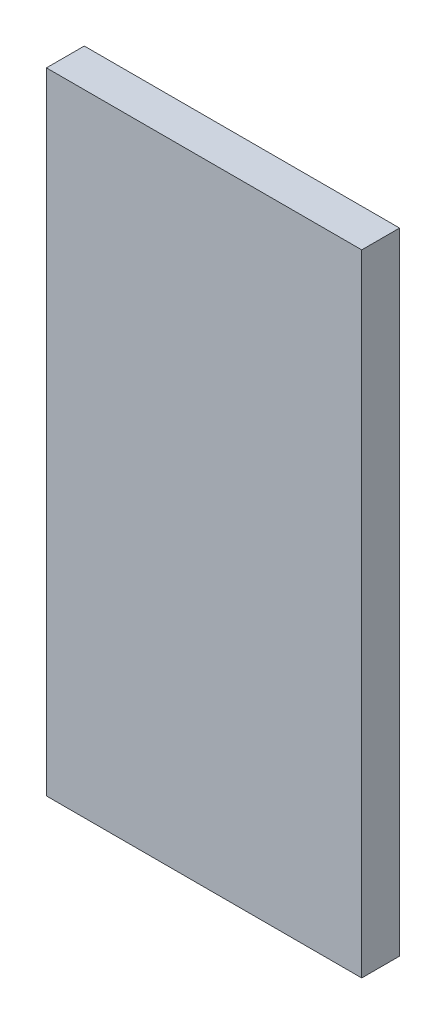
ISO-10303-21;
HEADER;
FILE_DESCRIPTION(('STEP AP214'),'2;1');
FILE_NAME('part.step','',(''),(''),'','','');
FILE_SCHEMA(('AUTOMOTIVE_DESIGN { 1 0 10303 214 1 1 1 1 }'));
ENDSEC;
DATA;
#1=APPLICATION_CONTEXT('core data for automotive mechanical design processes');
#2=APPLICATION_PROTOCOL_DEFINITION('international standard','automotive_design',2000,#1);
#3=PRODUCT_CONTEXT('',#1,'mechanical');
#4=PRODUCT('Part','Part','',(#3));
#5=PRODUCT_RELATED_PRODUCT_CATEGORY('part','',(#4));
#6=PRODUCT_DEFINITION_FORMATION('','',#4);
#7=PRODUCT_DEFINITION_CONTEXT('part definition',#1,'design');
#8=PRODUCT_DEFINITION('design','',#6,#7);
#9=PRODUCT_DEFINITION_SHAPE('','',#8);
#10=(LENGTH_UNIT() NAMED_UNIT(*) SI_UNIT(.MILLI.,.METRE.));
#11=(NAMED_UNIT(*) PLANE_ANGLE_UNIT() SI_UNIT($,.RADIAN.));
#12=(NAMED_UNIT(*) SI_UNIT($,.STERADIAN.) SOLID_ANGLE_UNIT());
#13=UNCERTAINTY_MEASURE_WITH_UNIT(LENGTH_MEASURE(1.E-05),#10,'distance_accuracy_value','');
#14=(GEOMETRIC_REPRESENTATION_CONTEXT(3) GLOBAL_UNCERTAINTY_ASSIGNED_CONTEXT((#13)) GLOBAL_UNIT_ASSIGNED_CONTEXT((#10,
#11,#12)) REPRESENTATION_CONTEXT('',''));
#15=CARTESIAN_POINT('',(0.,0.,0.));
#16=DIRECTION('',(0.,0.,1.));
#17=DIRECTION('',(1.,0.,0.));
#18=AXIS2_PLACEMENT_3D('',#15,#16,#17);
#19=CARTESIAN_POINT('',(0.125,-0.25,0.03));
#20=DIRECTION('',(-1.,0.,0.));
#21=DIRECTION('',(0.,0.,1.));
#22=AXIS2_PLACEMENT_3D('',#19,#20,#21);
#23=PLANE('',#22);
#24=DIRECTION('',(0.,1.,0.));
#25=VECTOR('',#24,1.);
#26=CARTESIAN_POINT('',(0.125,-0.25,0.));
#27=LINE('',#26,#25);
#28=CARTESIAN_POINT('',(0.125,-0.25,0.));
#29=VERTEX_POINT('',#28);
#30=CARTESIAN_POINT('',(0.125,0.25,0.));
#31=VERTEX_POINT('',#30);
#32=EDGE_CURVE('E110',#29,#31,#27,.T.);
#33=ORIENTED_EDGE('',*,*,#32,.T.);
#34=DIRECTION('',(0.,0.,-1.));
#35=VECTOR('',#34,1.);
#36=CARTESIAN_POINT('',(0.125,0.25,0.03));
#37=LINE('',#36,#35);
#38=CARTESIAN_POINT('',(0.125,0.25,0.03));
#39=VERTEX_POINT('',#38);
#40=EDGE_CURVE('E11',#39,#31,#37,.T.);
#41=ORIENTED_EDGE('',*,*,#40,.F.);
#42=DIRECTION('',(0.,1.,0.));
#43=VECTOR('',#42,1.);
#44=CARTESIAN_POINT('',(0.125,-0.25,0.03));
#45=LINE('',#44,#43);
#46=CARTESIAN_POINT('',(0.125,-0.25,0.03));
#47=VERTEX_POINT('',#46);
#48=EDGE_CURVE('E95',#47,#39,#45,.T.);
#49=ORIENTED_EDGE('',*,*,#48,.F.);
#50=DIRECTION('',(0.,0.,-1.));
#51=VECTOR('',#50,1.);
#52=CARTESIAN_POINT('',(0.125,-0.25,0.03));
#53=LINE('',#52,#51);
#54=EDGE_CURVE('E106',#47,#29,#53,.T.);
#55=ORIENTED_EDGE('',*,*,#54,.T.);
#56=EDGE_LOOP('',(#33,#41,#49,#55));
#57=FACE_BOUND('',#56,.T.);
#58=ADVANCED_FACE('F42',(#57),#23,.F.);
#59=CARTESIAN_POINT('',(-0.125,0.25,0.03));
#60=DIRECTION('',(0.,-1.,0.));
#61=DIRECTION('',(0.,0.,-1.));
#62=AXIS2_PLACEMENT_3D('',#59,#60,#61);
#63=PLANE('',#62);
#64=DIRECTION('',(-1.,0.,0.));
#65=VECTOR('',#64,1.);
#66=CARTESIAN_POINT('',(-0.125,0.25,0.));
#67=LINE('',#66,#65);
#68=CARTESIAN_POINT('',(-0.125,0.25,0.));
#69=VERTEX_POINT('',#68);
#70=EDGE_CURVE('E100',#31,#69,#67,.T.);
#71=ORIENTED_EDGE('',*,*,#70,.T.);
#72=DIRECTION('',(0.,0.,-1.));
#73=VECTOR('',#72,1.);
#74=CARTESIAN_POINT('',(-0.125,0.25,0.03));
#75=LINE('',#74,#73);
#76=CARTESIAN_POINT('',(-0.125,0.25,0.03));
#77=VERTEX_POINT('',#76);
#78=EDGE_CURVE('E50',#77,#69,#75,.T.);
#79=ORIENTED_EDGE('',*,*,#78,.F.);
#80=DIRECTION('',(-1.,0.,0.));
#81=VECTOR('',#80,1.);
#82=CARTESIAN_POINT('',(-0.125,0.25,0.03));
#83=LINE('',#82,#81);
#84=EDGE_CURVE('E90',#39,#77,#83,.T.);
#85=ORIENTED_EDGE('',*,*,#84,.F.);
#86=ORIENTED_EDGE('',*,*,#40,.T.);
#87=EDGE_LOOP('',(#71,#79,#85,#86));
#88=FACE_BOUND('',#87,.T.);
#89=ADVANCED_FACE('F99',(#88),#63,.F.);
#90=CARTESIAN_POINT('',(-0.125,-0.25,0.03));
#91=DIRECTION('',(1.,0.,0.));
#92=DIRECTION('',(0.,0.,-1.));
#93=AXIS2_PLACEMENT_3D('',#90,#91,#92);
#94=PLANE('',#93);
#95=DIRECTION('',(0.,-1.,0.));
#96=VECTOR('',#95,1.);
#97=CARTESIAN_POINT('',(-0.125,-0.25,0.));
#98=LINE('',#97,#96);
#99=CARTESIAN_POINT('',(-0.125,-0.25,0.));
#100=VERTEX_POINT('',#99);
#101=EDGE_CURVE('E77',#69,#100,#98,.T.);
#102=ORIENTED_EDGE('',*,*,#101,.T.);
#103=DIRECTION('',(0.,0.,-1.));
#104=VECTOR('',#103,1.);
#105=CARTESIAN_POINT('',(-0.125,-0.25,0.03));
#106=LINE('',#105,#104);
#107=CARTESIAN_POINT('',(-0.125,-0.25,0.03));
#108=VERTEX_POINT('',#107);
#109=EDGE_CURVE('E102',#108,#100,#106,.T.);
#110=ORIENTED_EDGE('',*,*,#109,.F.);
#111=DIRECTION('',(0.,-1.,0.));
#112=VECTOR('',#111,1.);
#113=CARTESIAN_POINT('',(-0.125,-0.25,0.03));
#114=LINE('',#113,#112);
#115=EDGE_CURVE('E93',#77,#108,#114,.T.);
#116=ORIENTED_EDGE('',*,*,#115,.F.);
#117=ORIENTED_EDGE('',*,*,#78,.T.);
#118=EDGE_LOOP('',(#102,#110,#116,#117));
#119=FACE_BOUND('',#118,.T.);
#120=ADVANCED_FACE('F103',(#119),#94,.F.);
#121=CARTESIAN_POINT('',(-0.125,-0.25,0.03));
#122=DIRECTION('',(0.,1.,0.));
#123=DIRECTION('',(0.,0.,1.));
#124=AXIS2_PLACEMENT_3D('',#121,#122,#123);
#125=PLANE('',#124);
#126=DIRECTION('',(1.,0.,0.));
#127=VECTOR('',#126,1.);
#128=CARTESIAN_POINT('',(-0.125,-0.25,0.));
#129=LINE('',#128,#127);
#130=EDGE_CURVE('E83',#100,#29,#129,.T.);
#131=ORIENTED_EDGE('',*,*,#130,.T.);
#132=ORIENTED_EDGE('',*,*,#54,.F.);
#133=DIRECTION('',(1.,0.,0.));
#134=VECTOR('',#133,1.);
#135=CARTESIAN_POINT('',(-0.125,-0.25,0.03));
#136=LINE('',#135,#134);
#137=EDGE_CURVE('E58',#108,#47,#136,.T.);
#138=ORIENTED_EDGE('',*,*,#137,.F.);
#139=ORIENTED_EDGE('',*,*,#109,.T.);
#140=EDGE_LOOP('',(#131,#132,#138,#139));
#141=FACE_BOUND('',#140,.T.);
#142=ADVANCED_FACE('F121',(#141),#125,.F.);
#143=CARTESIAN_POINT('',(0.,0.,0.03));
#144=DIRECTION('',(0.,0.,-1.));
#145=DIRECTION('',(-1.,0.,0.));
#146=AXIS2_PLACEMENT_3D('',#143,#144,#145);
#147=PLANE('',#146);
#148=ORIENTED_EDGE('',*,*,#48,.T.);
#149=ORIENTED_EDGE('',*,*,#84,.T.);
#150=ORIENTED_EDGE('',*,*,#115,.T.);
#151=ORIENTED_EDGE('',*,*,#137,.T.);
#152=EDGE_LOOP('',(#148,#149,#150,#151));
#153=FACE_BOUND('',#152,.T.);
#154=ADVANCED_FACE('F91',(#153),#147,.F.);
#155=CARTESIAN_POINT('',(0.,0.,0.));
#156=DIRECTION('',(0.,0.,-1.));
#157=DIRECTION('',(-1.,0.,0.));
#158=AXIS2_PLACEMENT_3D('',#155,#156,#157);
#159=PLANE('',#158);
#160=ORIENTED_EDGE('',*,*,#32,.F.);
#161=ORIENTED_EDGE('',*,*,#130,.F.);
#162=ORIENTED_EDGE('',*,*,#101,.F.);
#163=ORIENTED_EDGE('',*,*,#70,.F.);
#164=EDGE_LOOP('',(#160,#161,#162,#163));
#165=FACE_BOUND('',#164,.T.);
#166=ADVANCED_FACE('F124',(#165),#159,.T.);
#167=CLOSED_SHELL('',(#58,#89,#120,#142,#154,#166));
#168=MANIFOLD_SOLID_BREP('B2',#167);
#169=ADVANCED_BREP_SHAPE_REPRESENTATION('',(#18,#168),#14);
#170=SHAPE_DEFINITION_REPRESENTATION(#9,#169);
ENDSEC;
END-ISO-10303-21;
